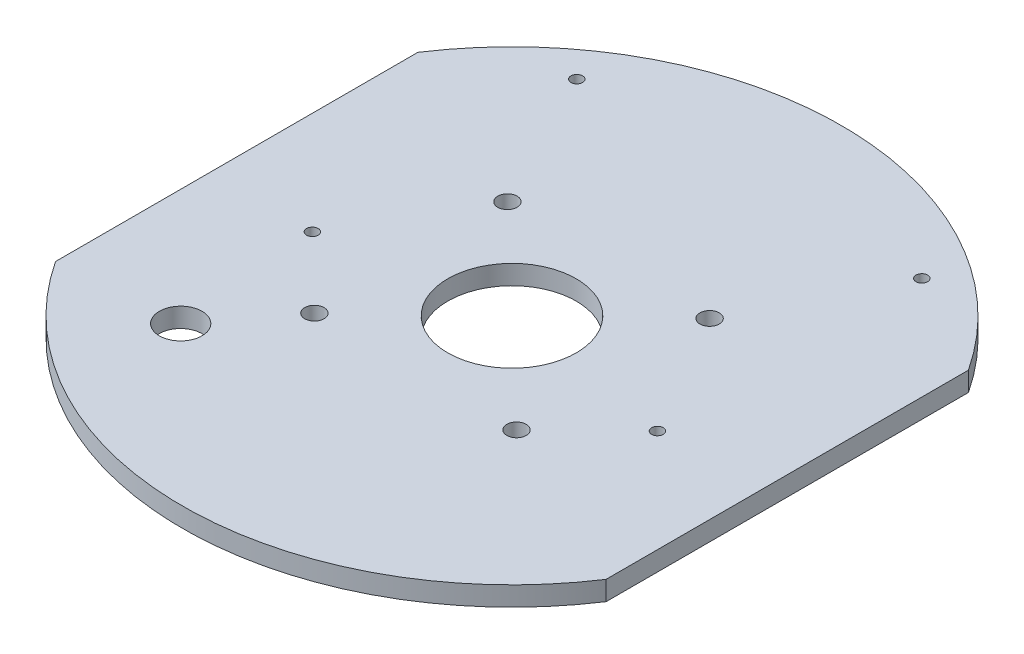
ISO-10303-21;
HEADER;
FILE_DESCRIPTION(('STEP AP214'),'2;1');
FILE_NAME('part.step','',(''),(''),'','','');
FILE_SCHEMA(('AUTOMOTIVE_DESIGN { 1 0 10303 214 1 1 1 1 }'));
ENDSEC;
DATA;
#1=APPLICATION_CONTEXT('core data for automotive mechanical design processes');
#2=APPLICATION_PROTOCOL_DEFINITION('international standard','automotive_design',2000,#1);
#3=PRODUCT_CONTEXT('',#1,'mechanical');
#4=PRODUCT('Part','Part','',(#3));
#5=PRODUCT_RELATED_PRODUCT_CATEGORY('part','',(#4));
#6=PRODUCT_DEFINITION_FORMATION('','',#4);
#7=PRODUCT_DEFINITION_CONTEXT('part definition',#1,'design');
#8=PRODUCT_DEFINITION('design','',#6,#7);
#9=PRODUCT_DEFINITION_SHAPE('','',#8);
#10=(LENGTH_UNIT() NAMED_UNIT(*) SI_UNIT(.MILLI.,.METRE.));
#11=(NAMED_UNIT(*) PLANE_ANGLE_UNIT() SI_UNIT($,.RADIAN.));
#12=(NAMED_UNIT(*) SI_UNIT($,.STERADIAN.) SOLID_ANGLE_UNIT());
#13=UNCERTAINTY_MEASURE_WITH_UNIT(LENGTH_MEASURE(1.E-05),#10,'distance_accuracy_value','');
#14=(GEOMETRIC_REPRESENTATION_CONTEXT(3) GLOBAL_UNCERTAINTY_ASSIGNED_CONTEXT((#13)) GLOBAL_UNIT_ASSIGNED_CONTEXT((#10,
#11,#12)) REPRESENTATION_CONTEXT('',''));
#15=CARTESIAN_POINT('',(0.,0.,0.));
#16=DIRECTION('',(0.,0.,1.));
#17=DIRECTION('',(1.,0.,0.));
#18=AXIS2_PLACEMENT_3D('',#15,#16,#17);
#19=CARTESIAN_POINT('',(71.,45.,-46.7332857821917));
#20=DIRECTION('',(0.,-1.,0.));
#21=DIRECTION('',(0.,0.,-1.));
#22=AXIS2_PLACEMENT_3D('',#19,#20,#21);
#23=PLANE('',#22);
#24=CARTESIAN_POINT('',(-26.0701081162833,45.,-24.896575322829));
#25=DIRECTION('',(0.,-1.,0.));
#26=DIRECTION('',(0.,0.,-1.));
#27=AXIS2_PLACEMENT_3D('',#24,#25,#26);
#28=CIRCLE('',#27,2.5);
#29=CARTESIAN_POINT('',(-26.0701081162833,45.,-27.396575322829));
#30=VERTEX_POINT('',#29);
#31=EDGE_CURVE('E44',#30,#30,#28,.T.);
#32=ORIENTED_EDGE('',*,*,#31,.F.);
#33=EDGE_LOOP('',(#32));
#34=FACE_BOUND('',#33,.T.);
#35=CARTESIAN_POINT('',(26.0701081162833,45.,-24.896575322829));
#36=DIRECTION('',(0.,-1.,0.));
#37=DIRECTION('',(0.,0.,-1.));
#38=AXIS2_PLACEMENT_3D('',#35,#36,#37);
#39=CIRCLE('',#38,2.5);
#40=CARTESIAN_POINT('',(26.0701081162833,45.,-27.396575322829));
#41=VERTEX_POINT('',#40);
#42=EDGE_CURVE('E163',#41,#41,#39,.T.);
#43=ORIENTED_EDGE('',*,*,#42,.F.);
#44=EDGE_LOOP('',(#43));
#45=FACE_BOUND('',#44,.T.);
#46=CARTESIAN_POINT('',(44.5,45.,-61.2102264039038));
#47=DIRECTION('',(0.,1.,0.));
#48=DIRECTION('',(0.,0.,1.));
#49=AXIS2_PLACEMENT_3D('',#46,#47,#48);
#50=CIRCLE('',#49,1.5);
#51=CARTESIAN_POINT('',(44.5,45.,-59.7102264039038));
#52=VERTEX_POINT('',#51);
#53=EDGE_CURVE('E126',#52,#52,#50,.T.);
#54=ORIENTED_EDGE('',*,*,#53,.T.);
#55=EDGE_LOOP('',(#54));
#56=FACE_BOUND('',#55,.T.);
#57=CARTESIAN_POINT('',(-44.5000000000006,45.,-61.2102264039038));
#58=DIRECTION('',(0.,1.,0.));
#59=DIRECTION('',(0.,0.,1.));
#60=AXIS2_PLACEMENT_3D('',#57,#58,#59);
#61=CIRCLE('',#60,1.49999999999892);
#62=CARTESIAN_POINT('',(-44.5000000000006,45.,-59.7102264039049));
#63=VERTEX_POINT('',#62);
#64=EDGE_CURVE('E129',#63,#63,#61,.T.);
#65=ORIENTED_EDGE('',*,*,#64,.T.);
#66=EDGE_LOOP('',(#65));
#67=FACE_BOUND('',#66,.T.);
#68=CARTESIAN_POINT('',(-44.5,45.,6.9897735960972));
#69=DIRECTION('',(0.,1.,0.));
#70=DIRECTION('',(0.,0.,1.));
#71=AXIS2_PLACEMENT_3D('',#68,#69,#70);
#72=CIRCLE('',#71,1.5);
#73=CARTESIAN_POINT('',(-44.5,45.,8.48977359609721));
#74=VERTEX_POINT('',#73);
#75=EDGE_CURVE('E132',#74,#74,#72,.T.);
#76=ORIENTED_EDGE('',*,*,#75,.T.);
#77=EDGE_LOOP('',(#76));
#78=FACE_BOUND('',#77,.T.);
#79=CARTESIAN_POINT('',(44.5,45.,6.9897735960972));
#80=DIRECTION('',(0.,1.,0.));
#81=DIRECTION('',(0.,0.,1.));
#82=AXIS2_PLACEMENT_3D('',#79,#80,#81);
#83=CIRCLE('',#82,1.5);
#84=CARTESIAN_POINT('',(44.5,45.,8.4897735960972));
#85=VERTEX_POINT('',#84);
#86=EDGE_CURVE('E135',#85,#85,#83,.T.);
#87=ORIENTED_EDGE('',*,*,#86,.T.);
#88=EDGE_LOOP('',(#87));
#89=FACE_BOUND('',#88,.T.);
#90=CARTESIAN_POINT('',(-41.,45.,44.4580418759452));
#91=DIRECTION('',(0.,1.,0.));
#92=DIRECTION('',(0.,0.,1.));
#93=AXIS2_PLACEMENT_3D('',#90,#91,#92);
#94=CIRCLE('',#93,5.5);
#95=CARTESIAN_POINT('',(-41.,45.,49.9580418759452));
#96=VERTEX_POINT('',#95);
#97=EDGE_CURVE('E115',#96,#96,#94,.T.);
#98=ORIENTED_EDGE('',*,*,#97,.T.);
#99=EDGE_LOOP('',(#98));
#100=FACE_BOUND('',#99,.T.);
#101=CARTESIAN_POINT('',(0.,45.,0.));
#102=DIRECTION('',(0.,1.,0.));
#103=DIRECTION('',(0.,0.,1.));
#104=AXIS2_PLACEMENT_3D('',#101,#102,#103);
#105=CIRCLE('',#104,16.5726019140085);
#106=CARTESIAN_POINT('',(0.,45.,16.5726019140085));
#107=VERTEX_POINT('',#106);
#108=EDGE_CURVE('E101',#107,#107,#105,.F.);
#109=ORIENTED_EDGE('',*,*,#108,.F.);
#110=EDGE_LOOP('',(#109));
#111=FACE_BOUND('',#110,.T.);
#112=CARTESIAN_POINT('',(0.,45.,0.));
#113=DIRECTION('',(0.,1.,0.));
#114=DIRECTION('',(0.,0.,1.));
#115=AXIS2_PLACEMENT_3D('',#112,#113,#114);
#116=CIRCLE('',#115,85.);
#117=CARTESIAN_POINT('',(71.,45.,-46.7332857821917));
#118=VERTEX_POINT('',#117);
#119=CARTESIAN_POINT('',(-71.,45.,-46.7332857821918));
#120=VERTEX_POINT('',#119);
#121=EDGE_CURVE('E109',#118,#120,#116,.T.);
#122=ORIENTED_EDGE('',*,*,#121,.F.);
#123=DIRECTION('',(0.,0.,1.));
#124=VECTOR('',#123,1.);
#125=CARTESIAN_POINT('',(71.,45.,0.));
#126=LINE('',#125,#124);
#127=CARTESIAN_POINT('',(71.,45.,46.7332857821917));
#128=VERTEX_POINT('',#127);
#129=EDGE_CURVE('E111',#118,#128,#126,.T.);
#130=ORIENTED_EDGE('',*,*,#129,.T.);
#131=CARTESIAN_POINT('',(-71.,45.,46.7332857821918));
#132=VERTEX_POINT('',#131);
#133=EDGE_CURVE('E106',#132,#128,#116,.T.);
#134=ORIENTED_EDGE('',*,*,#133,.F.);
#135=DIRECTION('',(0.,0.,-1.));
#136=VECTOR('',#135,1.);
#137=CARTESIAN_POINT('',(-71.,45.,0.));
#138=LINE('',#137,#136);
#139=EDGE_CURVE('E80',#132,#120,#138,.T.);
#140=ORIENTED_EDGE('',*,*,#139,.T.);
#141=EDGE_LOOP('',(#122,#130,#134,#140));
#142=FACE_BOUND('',#141,.T.);
#143=CARTESIAN_POINT('',(26.0701081162833,45.,24.896575322829));
#144=DIRECTION('',(0.,-1.,0.));
#145=DIRECTION('',(0.,0.,-1.));
#146=AXIS2_PLACEMENT_3D('',#143,#144,#145);
#147=CIRCLE('',#146,2.5);
#148=CARTESIAN_POINT('',(26.0701081162833,45.,22.396575322829));
#149=VERTEX_POINT('',#148);
#150=EDGE_CURVE('E161',#149,#149,#147,.T.);
#151=ORIENTED_EDGE('',*,*,#150,.F.);
#152=EDGE_LOOP('',(#151));
#153=FACE_BOUND('',#152,.T.);
#154=CARTESIAN_POINT('',(-26.0701081162833,45.,24.896575322829));
#155=DIRECTION('',(0.,-1.,0.));
#156=DIRECTION('',(0.,0.,-1.));
#157=AXIS2_PLACEMENT_3D('',#154,#155,#156);
#158=CIRCLE('',#157,2.5);
#159=CARTESIAN_POINT('',(-26.0701081162833,45.,22.396575322829));
#160=VERTEX_POINT('',#159);
#161=EDGE_CURVE('E158',#160,#160,#158,.T.);
#162=ORIENTED_EDGE('',*,*,#161,.F.);
#163=EDGE_LOOP('',(#162));
#164=FACE_BOUND('',#163,.T.);
#165=ADVANCED_FACE('F40',(#34,#45,#56,#67,#78,#89,#100,#111,#142,#153,#164),#23,.T.);
#166=CARTESIAN_POINT('',(0.,45.,0.));
#167=DIRECTION('',(0.,1.,0.));
#168=DIRECTION('',(0.,0.,1.));
#169=AXIS2_PLACEMENT_3D('',#166,#167,#168);
#170=CYLINDRICAL_SURFACE('',#169,85.);
#171=DIRECTION('',(0.,1.,0.));
#172=VECTOR('',#171,1.);
#173=CARTESIAN_POINT('',(71.,40.,46.7332857821917));
#174=LINE('',#173,#172);
#175=CARTESIAN_POINT('',(71.,50.,46.7332857821917));
#176=VERTEX_POINT('',#175);
#177=EDGE_CURVE('E100',#128,#176,#174,.T.);
#178=ORIENTED_EDGE('',*,*,#177,.T.);
#179=CARTESIAN_POINT('',(0.,50.,0.));
#180=DIRECTION('',(0.,1.,0.));
#181=DIRECTION('',(0.,0.,1.));
#182=AXIS2_PLACEMENT_3D('',#179,#180,#181);
#183=CIRCLE('',#182,85.);
#184=CARTESIAN_POINT('',(-71.,50.,46.7332857821917));
#185=VERTEX_POINT('',#184);
#186=EDGE_CURVE('E93',#185,#176,#183,.T.);
#187=ORIENTED_EDGE('',*,*,#186,.F.);
#188=DIRECTION('',(0.,1.,0.));
#189=VECTOR('',#188,1.);
#190=CARTESIAN_POINT('',(-71.,40.,46.7332857821918));
#191=LINE('',#190,#189);
#192=EDGE_CURVE('E77',#132,#185,#191,.T.);
#193=ORIENTED_EDGE('',*,*,#192,.F.);
#194=ORIENTED_EDGE('',*,*,#133,.T.);
#195=EDGE_LOOP('',(#178,#187,#193,#194));
#196=FACE_BOUND('',#195,.T.);
#197=ADVANCED_FACE('F99',(#196),#170,.T.);
#198=CARTESIAN_POINT('',(0.,50.,0.));
#199=DIRECTION('',(0.,1.,0.));
#200=DIRECTION('',(0.,0.,1.));
#201=AXIS2_PLACEMENT_3D('',#198,#199,#200);
#202=PLANE('',#201);
#203=CARTESIAN_POINT('',(-26.0701081162833,50.,24.896575322829));
#204=DIRECTION('',(0.,-1.,0.));
#205=DIRECTION('',(0.,0.,-1.));
#206=AXIS2_PLACEMENT_3D('',#203,#204,#205);
#207=CIRCLE('',#206,2.5);
#208=CARTESIAN_POINT('',(-26.0701081162833,50.,22.396575322829));
#209=VERTEX_POINT('',#208);
#210=EDGE_CURVE('E11',#209,#209,#207,.T.);
#211=ORIENTED_EDGE('',*,*,#210,.T.);
#212=EDGE_LOOP('',(#211));
#213=FACE_BOUND('',#212,.T.);
#214=CARTESIAN_POINT('',(26.0701081162833,50.,24.896575322829));
#215=DIRECTION('',(0.,-1.,0.));
#216=DIRECTION('',(0.,0.,-1.));
#217=AXIS2_PLACEMENT_3D('',#214,#215,#216);
#218=CIRCLE('',#217,2.5);
#219=CARTESIAN_POINT('',(26.0701081162833,50.,22.396575322829));
#220=VERTEX_POINT('',#219);
#221=EDGE_CURVE('E50',#220,#220,#218,.T.);
#222=ORIENTED_EDGE('',*,*,#221,.T.);
#223=EDGE_LOOP('',(#222));
#224=FACE_BOUND('',#223,.T.);
#225=CARTESIAN_POINT('',(26.0701081162833,50.,-24.896575322829));
#226=DIRECTION('',(0.,-1.,0.));
#227=DIRECTION('',(0.,0.,-1.));
#228=AXIS2_PLACEMENT_3D('',#225,#226,#227);
#229=CIRCLE('',#228,2.5);
#230=CARTESIAN_POINT('',(26.0701081162833,50.,-27.396575322829));
#231=VERTEX_POINT('',#230);
#232=EDGE_CURVE('E152',#231,#231,#229,.T.);
#233=ORIENTED_EDGE('',*,*,#232,.T.);
#234=EDGE_LOOP('',(#233));
#235=FACE_BOUND('',#234,.T.);
#236=CARTESIAN_POINT('',(-26.0701081162833,50.,-24.896575322829));
#237=DIRECTION('',(0.,-1.,0.));
#238=DIRECTION('',(0.,0.,-1.));
#239=AXIS2_PLACEMENT_3D('',#236,#237,#238);
#240=CIRCLE('',#239,2.5);
#241=CARTESIAN_POINT('',(-26.0701081162833,50.,-27.396575322829));
#242=VERTEX_POINT('',#241);
#243=EDGE_CURVE('E145',#242,#242,#240,.T.);
#244=ORIENTED_EDGE('',*,*,#243,.T.);
#245=EDGE_LOOP('',(#244));
#246=FACE_BOUND('',#245,.T.);
#247=CARTESIAN_POINT('',(44.5,50.,-61.2102264039038));
#248=DIRECTION('',(0.,1.,0.));
#249=DIRECTION('',(0.,0.,1.));
#250=AXIS2_PLACEMENT_3D('',#247,#248,#249);
#251=CIRCLE('',#250,1.5);
#252=CARTESIAN_POINT('',(44.5,50.,-59.7102264039038));
#253=VERTEX_POINT('',#252);
#254=EDGE_CURVE('E142',#253,#253,#251,.T.);
#255=ORIENTED_EDGE('',*,*,#254,.F.);
#256=EDGE_LOOP('',(#255));
#257=FACE_BOUND('',#256,.T.);
#258=CARTESIAN_POINT('',(-44.5000000000006,50.,-61.2102264039038));
#259=DIRECTION('',(0.,1.,0.));
#260=DIRECTION('',(0.,0.,1.));
#261=AXIS2_PLACEMENT_3D('',#258,#259,#260);
#262=CIRCLE('',#261,1.49999999999892);
#263=CARTESIAN_POINT('',(-44.5000000000006,50.,-59.7102264039049));
#264=VERTEX_POINT('',#263);
#265=EDGE_CURVE('E146',#264,#264,#262,.T.);
#266=ORIENTED_EDGE('',*,*,#265,.F.);
#267=EDGE_LOOP('',(#266));
#268=FACE_BOUND('',#267,.T.);
#269=CARTESIAN_POINT('',(-44.5,50.,6.9897735960972));
#270=DIRECTION('',(0.,1.,0.));
#271=DIRECTION('',(0.,0.,1.));
#272=AXIS2_PLACEMENT_3D('',#269,#270,#271);
#273=CIRCLE('',#272,1.5);
#274=CARTESIAN_POINT('',(-44.5,50.,8.48977359609721));
#275=VERTEX_POINT('',#274);
#276=EDGE_CURVE('E141',#275,#275,#273,.T.);
#277=ORIENTED_EDGE('',*,*,#276,.F.);
#278=EDGE_LOOP('',(#277));
#279=FACE_BOUND('',#278,.T.);
#280=CARTESIAN_POINT('',(44.5,50.,6.9897735960972));
#281=DIRECTION('',(0.,1.,0.));
#282=DIRECTION('',(0.,0.,1.));
#283=AXIS2_PLACEMENT_3D('',#280,#281,#282);
#284=CIRCLE('',#283,1.5);
#285=CARTESIAN_POINT('',(44.5,50.,8.4897735960972));
#286=VERTEX_POINT('',#285);
#287=EDGE_CURVE('E138',#286,#286,#284,.T.);
#288=ORIENTED_EDGE('',*,*,#287,.F.);
#289=EDGE_LOOP('',(#288));
#290=FACE_BOUND('',#289,.T.);
#291=CARTESIAN_POINT('',(-41.,50.,44.4580418759452));
#292=DIRECTION('',(0.,1.,0.));
#293=DIRECTION('',(0.,0.,1.));
#294=AXIS2_PLACEMENT_3D('',#291,#292,#293);
#295=CIRCLE('',#294,5.5);
#296=CARTESIAN_POINT('',(-41.,50.,49.9580418759452));
#297=VERTEX_POINT('',#296);
#298=EDGE_CURVE('E123',#297,#297,#295,.T.);
#299=ORIENTED_EDGE('',*,*,#298,.F.);
#300=EDGE_LOOP('',(#299));
#301=FACE_BOUND('',#300,.T.);
#302=DIRECTION('',(0.,0.,1.));
#303=VECTOR('',#302,1.);
#304=CARTESIAN_POINT('',(71.,50.,-46.7332857821917));
#305=LINE('',#304,#303);
#306=CARTESIAN_POINT('',(71.,50.,-46.7332857821917));
#307=VERTEX_POINT('',#306);
#308=EDGE_CURVE('E96',#307,#176,#305,.T.);
#309=ORIENTED_EDGE('',*,*,#308,.F.);
#310=CARTESIAN_POINT('',(-71.,50.,-46.7332857821918));
#311=VERTEX_POINT('',#310);
#312=EDGE_CURVE('E95',#307,#311,#183,.T.);
#313=ORIENTED_EDGE('',*,*,#312,.T.);
#314=DIRECTION('',(0.,0.,-1.));
#315=VECTOR('',#314,1.);
#316=CARTESIAN_POINT('',(-71.,50.,-46.7332857821918));
#317=LINE('',#316,#315);
#318=EDGE_CURVE('E57',#185,#311,#317,.T.);
#319=ORIENTED_EDGE('',*,*,#318,.F.);
#320=ORIENTED_EDGE('',*,*,#186,.T.);
#321=EDGE_LOOP('',(#309,#313,#319,#320));
#322=FACE_BOUND('',#321,.T.);
#323=CARTESIAN_POINT('',(0.,50.,0.));
#324=DIRECTION('',(0.,1.,0.));
#325=DIRECTION('',(0.,0.,1.));
#326=AXIS2_PLACEMENT_3D('',#323,#324,#325);
#327=CIRCLE('',#326,16.5726019140085);
#328=CARTESIAN_POINT('',(0.,50.,16.5726019140085));
#329=VERTEX_POINT('',#328);
#330=EDGE_CURVE('E104',#329,#329,#327,.F.);
#331=ORIENTED_EDGE('',*,*,#330,.T.);
#332=EDGE_LOOP('',(#331));
#333=FACE_BOUND('',#332,.T.);
#334=ADVANCED_FACE('F91',(#213,#224,#235,#246,#257,#268,#279,#290,#301,#322,#333),#202,.T.);
#335=CARTESIAN_POINT('',(26.0701081162833,118.216909723841,24.896575322829));
#336=DIRECTION('',(0.,-1.,0.));
#337=DIRECTION('',(0.,0.,-1.));
#338=AXIS2_PLACEMENT_3D('',#335,#336,#337);
#339=CYLINDRICAL_SURFACE('',#338,2.5);
#340=ORIENTED_EDGE('',*,*,#221,.F.);
#341=EDGE_LOOP('',(#340));
#342=FACE_BOUND('',#341,.T.);
#343=ORIENTED_EDGE('',*,*,#150,.T.);
#344=EDGE_LOOP('',(#343));
#345=FACE_BOUND('',#344,.T.);
#346=ADVANCED_FACE('F198',(#342,#345),#339,.F.);
#347=CARTESIAN_POINT('',(-26.0701081162833,118.216909723841,24.896575322829));
#348=DIRECTION('',(0.,-1.,0.));
#349=DIRECTION('',(0.,0.,-1.));
#350=AXIS2_PLACEMENT_3D('',#347,#348,#349);
#351=CYLINDRICAL_SURFACE('',#350,2.5);
#352=ORIENTED_EDGE('',*,*,#210,.F.);
#353=EDGE_LOOP('',(#352));
#354=FACE_BOUND('',#353,.T.);
#355=ORIENTED_EDGE('',*,*,#161,.T.);
#356=EDGE_LOOP('',(#355));
#357=FACE_BOUND('',#356,.T.);
#358=ADVANCED_FACE('F196',(#354,#357),#351,.F.);
#359=CARTESIAN_POINT('',(-26.0701081162833,118.216909723841,-24.896575322829));
#360=DIRECTION('',(0.,-1.,0.));
#361=DIRECTION('',(0.,0.,-1.));
#362=AXIS2_PLACEMENT_3D('',#359,#360,#361);
#363=CYLINDRICAL_SURFACE('',#362,2.5);
#364=ORIENTED_EDGE('',*,*,#243,.F.);
#365=EDGE_LOOP('',(#364));
#366=FACE_BOUND('',#365,.T.);
#367=ORIENTED_EDGE('',*,*,#31,.T.);
#368=EDGE_LOOP('',(#367));
#369=FACE_BOUND('',#368,.T.);
#370=ADVANCED_FACE('F170',(#366,#369),#363,.F.);
#371=CARTESIAN_POINT('',(26.0701081162833,118.216909723841,-24.896575322829));
#372=DIRECTION('',(0.,-1.,0.));
#373=DIRECTION('',(0.,0.,-1.));
#374=AXIS2_PLACEMENT_3D('',#371,#372,#373);
#375=CYLINDRICAL_SURFACE('',#374,2.5);
#376=ORIENTED_EDGE('',*,*,#232,.F.);
#377=EDGE_LOOP('',(#376));
#378=FACE_BOUND('',#377,.T.);
#379=ORIENTED_EDGE('',*,*,#42,.T.);
#380=EDGE_LOOP('',(#379));
#381=FACE_BOUND('',#380,.T.);
#382=ADVANCED_FACE('F42',(#378,#381),#375,.F.);
#383=CARTESIAN_POINT('',(44.5,40.,-61.2102264039038));
#384=DIRECTION('',(0.,1.,0.));
#385=DIRECTION('',(0.,0.,1.));
#386=AXIS2_PLACEMENT_3D('',#383,#384,#385);
#387=CYLINDRICAL_SURFACE('',#386,1.5);
#388=ORIENTED_EDGE('',*,*,#254,.T.);
#389=EDGE_LOOP('',(#388));
#390=FACE_BOUND('',#389,.T.);
#391=ORIENTED_EDGE('',*,*,#53,.F.);
#392=EDGE_LOOP('',(#391));
#393=FACE_BOUND('',#392,.T.);
#394=ADVANCED_FACE('F246',(#390,#393),#387,.F.);
#395=CARTESIAN_POINT('',(-44.5000000000006,40.,-61.2102264039038));
#396=DIRECTION('',(0.,1.,0.));
#397=DIRECTION('',(0.,0.,1.));
#398=AXIS2_PLACEMENT_3D('',#395,#396,#397);
#399=CYLINDRICAL_SURFACE('',#398,1.49999999999892);
#400=ORIENTED_EDGE('',*,*,#265,.T.);
#401=EDGE_LOOP('',(#400));
#402=FACE_BOUND('',#401,.T.);
#403=ORIENTED_EDGE('',*,*,#64,.F.);
#404=EDGE_LOOP('',(#403));
#405=FACE_BOUND('',#404,.T.);
#406=ADVANCED_FACE('F242',(#402,#405),#399,.F.);
#407=CARTESIAN_POINT('',(-44.5,40.,6.9897735960972));
#408=DIRECTION('',(0.,1.,0.));
#409=DIRECTION('',(0.,0.,1.));
#410=AXIS2_PLACEMENT_3D('',#407,#408,#409);
#411=CYLINDRICAL_SURFACE('',#410,1.5);
#412=ORIENTED_EDGE('',*,*,#276,.T.);
#413=EDGE_LOOP('',(#412));
#414=FACE_BOUND('',#413,.T.);
#415=ORIENTED_EDGE('',*,*,#75,.F.);
#416=EDGE_LOOP('',(#415));
#417=FACE_BOUND('',#416,.T.);
#418=ADVANCED_FACE('F235',(#414,#417),#411,.F.);
#419=CARTESIAN_POINT('',(44.5,40.,6.9897735960972));
#420=DIRECTION('',(0.,1.,0.));
#421=DIRECTION('',(0.,0.,1.));
#422=AXIS2_PLACEMENT_3D('',#419,#420,#421);
#423=CYLINDRICAL_SURFACE('',#422,1.5);
#424=ORIENTED_EDGE('',*,*,#287,.T.);
#425=EDGE_LOOP('',(#424));
#426=FACE_BOUND('',#425,.T.);
#427=ORIENTED_EDGE('',*,*,#86,.F.);
#428=EDGE_LOOP('',(#427));
#429=FACE_BOUND('',#428,.T.);
#430=ADVANCED_FACE('F228',(#426,#429),#423,.F.);
#431=CARTESIAN_POINT('',(-41.,-5.00000000000002,44.4580418759452));
#432=DIRECTION('',(0.,1.,0.));
#433=DIRECTION('',(0.,0.,1.));
#434=AXIS2_PLACEMENT_3D('',#431,#432,#433);
#435=CYLINDRICAL_SURFACE('',#434,5.5);
#436=ORIENTED_EDGE('',*,*,#298,.T.);
#437=EDGE_LOOP('',(#436));
#438=FACE_BOUND('',#437,.T.);
#439=ORIENTED_EDGE('',*,*,#97,.F.);
#440=EDGE_LOOP('',(#439));
#441=FACE_BOUND('',#440,.T.);
#442=ADVANCED_FACE('F220',(#438,#441),#435,.F.);
#443=DIRECTION('',(0.,1.,0.));
#444=VECTOR('',#443,1.);
#445=CARTESIAN_POINT('',(71.,40.,-46.7332857821917));
#446=LINE('',#445,#444);
#447=EDGE_CURVE('E117',#118,#307,#446,.T.);
#448=ORIENTED_EDGE('',*,*,#447,.F.);
#449=ORIENTED_EDGE('',*,*,#121,.T.);
#450=DIRECTION('',(0.,1.,0.));
#451=VECTOR('',#450,1.);
#452=CARTESIAN_POINT('',(-71.,40.,-46.7332857821918));
#453=LINE('',#452,#451);
#454=EDGE_CURVE('E85',#120,#311,#453,.T.);
#455=ORIENTED_EDGE('',*,*,#454,.T.);
#456=ORIENTED_EDGE('',*,*,#312,.F.);
#457=EDGE_LOOP('',(#448,#449,#455,#456));
#458=FACE_BOUND('',#457,.T.);
#459=ADVANCED_FACE('F211',(#458),#170,.T.);
#460=CARTESIAN_POINT('',(71.,40.,-46.7332857821917));
#461=DIRECTION('',(-1.,0.,0.));
#462=DIRECTION('',(0.,0.,1.));
#463=AXIS2_PLACEMENT_3D('',#460,#461,#462);
#464=PLANE('',#463);
#465=ORIENTED_EDGE('',*,*,#447,.T.);
#466=ORIENTED_EDGE('',*,*,#308,.T.);
#467=ORIENTED_EDGE('',*,*,#177,.F.);
#468=ORIENTED_EDGE('',*,*,#129,.F.);
#469=EDGE_LOOP('',(#465,#466,#467,#468));
#470=FACE_BOUND('',#469,.T.);
#471=ADVANCED_FACE('F219',(#470),#464,.F.);
#472=CARTESIAN_POINT('',(-71.,40.,-46.7332857821918));
#473=DIRECTION('',(1.,0.,0.));
#474=DIRECTION('',(0.,0.,-1.));
#475=AXIS2_PLACEMENT_3D('',#472,#473,#474);
#476=PLANE('',#475);
#477=ORIENTED_EDGE('',*,*,#192,.T.);
#478=ORIENTED_EDGE('',*,*,#318,.T.);
#479=ORIENTED_EDGE('',*,*,#454,.F.);
#480=ORIENTED_EDGE('',*,*,#139,.F.);
#481=EDGE_LOOP('',(#477,#478,#479,#480));
#482=FACE_BOUND('',#481,.T.);
#483=ADVANCED_FACE('F78',(#482),#476,.F.);
#484=CARTESIAN_POINT('',(0.,92.0000000000001,0.));
#485=DIRECTION('',(0.,-1.,0.));
#486=DIRECTION('',(0.,0.,-1.));
#487=AXIS2_PLACEMENT_3D('',#484,#485,#486);
#488=CYLINDRICAL_SURFACE('',#487,16.5726019140085);
#489=ORIENTED_EDGE('',*,*,#330,.F.);
#490=EDGE_LOOP('',(#489));
#491=FACE_BOUND('',#490,.T.);
#492=ORIENTED_EDGE('',*,*,#108,.T.);
#493=EDGE_LOOP('',(#492));
#494=FACE_BOUND('',#493,.T.);
#495=ADVANCED_FACE('F175',(#491,#494),#488,.F.);
#496=CLOSED_SHELL('',(#165,#197,#334,#346,#358,#370,#382,#394,#406,#418,#430,#442,#459,#471,
#483,#495));
#497=MANIFOLD_SOLID_BREP('B2',#496);
#498=ADVANCED_BREP_SHAPE_REPRESENTATION('',(#18,#497),#14);
#499=SHAPE_DEFINITION_REPRESENTATION(#9,#498);
ENDSEC;
END-ISO-10303-21;
